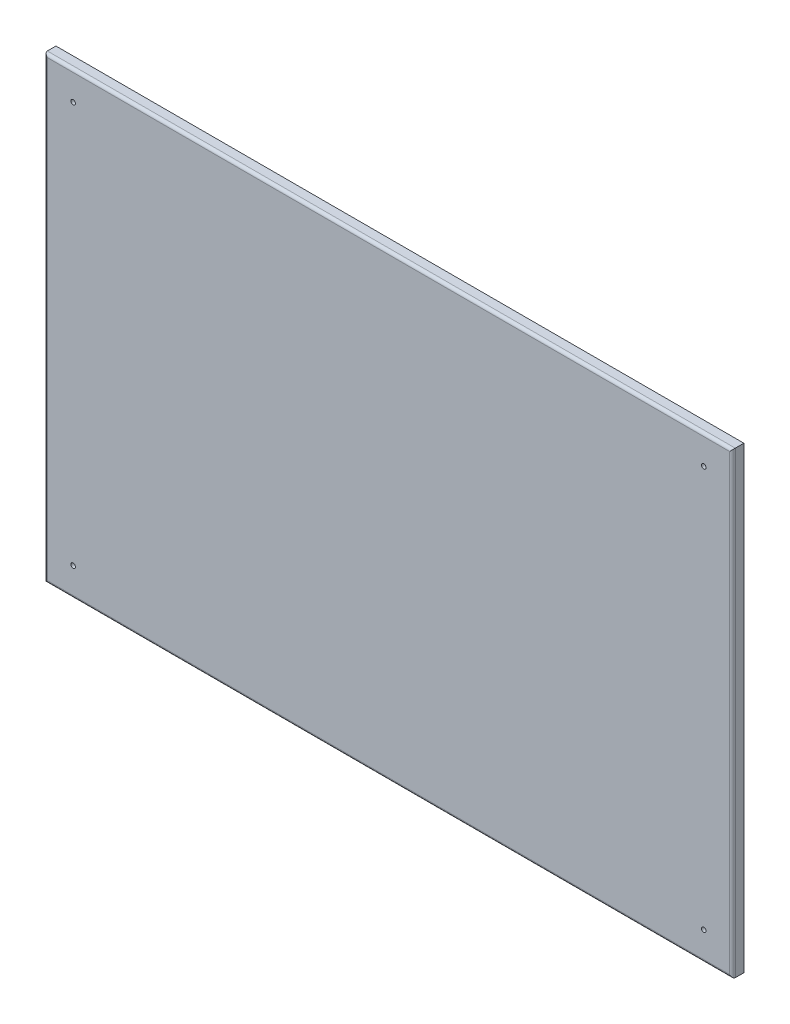
ISO-10303-21;
HEADER;
FILE_DESCRIPTION(('STEP AP214'),'2;1');
FILE_NAME('part.step','',(''),(''),'','','');
FILE_SCHEMA(('AUTOMOTIVE_DESIGN { 1 0 10303 214 1 1 1 1 }'));
ENDSEC;
DATA;
#1=APPLICATION_CONTEXT('core data for automotive mechanical design processes');
#2=APPLICATION_PROTOCOL_DEFINITION('international standard','automotive_design',2000,#1);
#3=PRODUCT_CONTEXT('',#1,'mechanical');
#4=PRODUCT('Part','Part','',(#3));
#5=PRODUCT_RELATED_PRODUCT_CATEGORY('part','',(#4));
#6=PRODUCT_DEFINITION_FORMATION('','',#4);
#7=PRODUCT_DEFINITION_CONTEXT('part definition',#1,'design');
#8=PRODUCT_DEFINITION('design','',#6,#7);
#9=PRODUCT_DEFINITION_SHAPE('','',#8);
#10=(LENGTH_UNIT() NAMED_UNIT(*) SI_UNIT(.MILLI.,.METRE.));
#11=(NAMED_UNIT(*) PLANE_ANGLE_UNIT() SI_UNIT($,.RADIAN.));
#12=(NAMED_UNIT(*) SI_UNIT($,.STERADIAN.) SOLID_ANGLE_UNIT());
#13=UNCERTAINTY_MEASURE_WITH_UNIT(LENGTH_MEASURE(1.E-05),#10,'distance_accuracy_value','');
#14=(GEOMETRIC_REPRESENTATION_CONTEXT(3) GLOBAL_UNCERTAINTY_ASSIGNED_CONTEXT((#13)) GLOBAL_UNIT_ASSIGNED_CONTEXT((#10,
#11,#12)) REPRESENTATION_CONTEXT('',''));
#15=CARTESIAN_POINT('',(0.,0.,0.));
#16=DIRECTION('',(0.,0.,1.));
#17=DIRECTION('',(1.,0.,0.));
#18=AXIS2_PLACEMENT_3D('',#15,#16,#17);
#19=CARTESIAN_POINT('',(600.,-400.,20.));
#20=DIRECTION('',(-1.,0.,0.));
#21=DIRECTION('',(0.,0.,1.));
#22=AXIS2_PLACEMENT_3D('',#19,#20,#21);
#23=PLANE('',#22);
#24=DIRECTION('',(0.,0.,-1.));
#25=VECTOR('',#24,1.);
#26=CARTESIAN_POINT('',(600.,400.,20.));
#27=LINE('',#26,#25);
#28=CARTESIAN_POINT('',(600.,400.,15.));
#29=VERTEX_POINT('',#28);
#30=CARTESIAN_POINT('',(600.,400.,0.));
#31=VERTEX_POINT('',#30);
#32=EDGE_CURVE('E93',#29,#31,#27,.T.);
#33=ORIENTED_EDGE('',*,*,#32,.F.);
#34=DIRECTION('',(0.,1.,0.));
#35=VECTOR('',#34,1.);
#36=CARTESIAN_POINT('',(600.,-400.,15.));
#37=LINE('',#36,#35);
#38=CARTESIAN_POINT('',(600.,-400.,15.));
#39=VERTEX_POINT('',#38);
#40=EDGE_CURVE('E11',#29,#39,#37,.F.);
#41=ORIENTED_EDGE('',*,*,#40,.T.);
#42=DIRECTION('',(0.,0.,-1.));
#43=VECTOR('',#42,1.);
#44=CARTESIAN_POINT('',(600.,-400.,20.));
#45=LINE('',#44,#43);
#46=CARTESIAN_POINT('',(600.,-400.,0.));
#47=VERTEX_POINT('',#46);
#48=EDGE_CURVE('E112',#39,#47,#45,.T.);
#49=ORIENTED_EDGE('',*,*,#48,.T.);
#50=DIRECTION('',(0.,1.,0.));
#51=VECTOR('',#50,1.);
#52=CARTESIAN_POINT('',(600.,-400.,0.));
#53=LINE('',#52,#51);
#54=EDGE_CURVE('E106',#47,#31,#53,.T.);
#55=ORIENTED_EDGE('',*,*,#54,.T.);
#56=EDGE_LOOP('',(#33,#41,#49,#55));
#57=FACE_BOUND('',#56,.T.);
#58=ADVANCED_FACE('F39',(#57),#23,.F.);
#59=CARTESIAN_POINT('',(-600.,400.,20.));
#60=DIRECTION('',(0.,-1.,0.));
#61=DIRECTION('',(0.,0.,-1.));
#62=AXIS2_PLACEMENT_3D('',#59,#60,#61);
#63=PLANE('',#62);
#64=DIRECTION('',(0.,0.,-1.));
#65=VECTOR('',#64,1.);
#66=CARTESIAN_POINT('',(-600.,400.,20.));
#67=LINE('',#66,#65);
#68=CARTESIAN_POINT('',(-600.,400.,15.));
#69=VERTEX_POINT('',#68);
#70=CARTESIAN_POINT('',(-600.,400.,0.));
#71=VERTEX_POINT('',#70);
#72=EDGE_CURVE('E99',#69,#71,#67,.T.);
#73=ORIENTED_EDGE('',*,*,#72,.F.);
#74=DIRECTION('',(-1.,0.,0.));
#75=VECTOR('',#74,1.);
#76=CARTESIAN_POINT('',(-600.,400.,15.));
#77=LINE('',#76,#75);
#78=EDGE_CURVE('E57',#69,#29,#77,.F.);
#79=ORIENTED_EDGE('',*,*,#78,.T.);
#80=ORIENTED_EDGE('',*,*,#32,.T.);
#81=DIRECTION('',(-1.,0.,0.));
#82=VECTOR('',#81,1.);
#83=CARTESIAN_POINT('',(-600.,400.,0.));
#84=LINE('',#83,#82);
#85=EDGE_CURVE('E94',#31,#71,#84,.T.);
#86=ORIENTED_EDGE('',*,*,#85,.T.);
#87=EDGE_LOOP('',(#73,#79,#80,#86));
#88=FACE_BOUND('',#87,.T.);
#89=ADVANCED_FACE('F91',(#88),#63,.F.);
#90=CARTESIAN_POINT('',(-600.,-400.,20.));
#91=DIRECTION('',(1.,0.,0.));
#92=DIRECTION('',(0.,0.,-1.));
#93=AXIS2_PLACEMENT_3D('',#90,#91,#92);
#94=PLANE('',#93);
#95=DIRECTION('',(0.,0.,-1.));
#96=VECTOR('',#95,1.);
#97=CARTESIAN_POINT('',(-600.,-400.,20.));
#98=LINE('',#97,#96);
#99=CARTESIAN_POINT('',(-600.,-400.,15.));
#100=VERTEX_POINT('',#99);
#101=CARTESIAN_POINT('',(-600.,-400.,0.));
#102=VERTEX_POINT('',#101);
#103=EDGE_CURVE('E123',#100,#102,#98,.T.);
#104=ORIENTED_EDGE('',*,*,#103,.F.);
#105=DIRECTION('',(0.,-1.,0.));
#106=VECTOR('',#105,1.);
#107=CARTESIAN_POINT('',(-600.,-400.,15.));
#108=LINE('',#107,#106);
#109=EDGE_CURVE('E48',#100,#69,#108,.F.);
#110=ORIENTED_EDGE('',*,*,#109,.T.);
#111=ORIENTED_EDGE('',*,*,#72,.T.);
#112=DIRECTION('',(0.,-1.,0.));
#113=VECTOR('',#112,1.);
#114=CARTESIAN_POINT('',(-600.,-400.,0.));
#115=LINE('',#114,#113);
#116=EDGE_CURVE('E107',#71,#102,#115,.T.);
#117=ORIENTED_EDGE('',*,*,#116,.T.);
#118=EDGE_LOOP('',(#104,#110,#111,#117));
#119=FACE_BOUND('',#118,.T.);
#120=ADVANCED_FACE('F162',(#119),#94,.F.);
#121=CARTESIAN_POINT('',(-600.,-400.,20.));
#122=DIRECTION('',(0.,1.,0.));
#123=DIRECTION('',(0.,0.,1.));
#124=AXIS2_PLACEMENT_3D('',#121,#122,#123);
#125=PLANE('',#124);
#126=ORIENTED_EDGE('',*,*,#48,.F.);
#127=DIRECTION('',(1.,0.,0.));
#128=VECTOR('',#127,1.);
#129=CARTESIAN_POINT('',(-600.,-400.,15.));
#130=LINE('',#129,#128);
#131=EDGE_CURVE('E135',#39,#100,#130,.F.);
#132=ORIENTED_EDGE('',*,*,#131,.T.);
#133=ORIENTED_EDGE('',*,*,#103,.T.);
#134=DIRECTION('',(1.,0.,0.));
#135=VECTOR('',#134,1.);
#136=CARTESIAN_POINT('',(-600.,-400.,0.));
#137=LINE('',#136,#135);
#138=EDGE_CURVE('E121',#102,#47,#137,.T.);
#139=ORIENTED_EDGE('',*,*,#138,.T.);
#140=EDGE_LOOP('',(#126,#132,#133,#139));
#141=FACE_BOUND('',#140,.T.);
#142=ADVANCED_FACE('F165',(#141),#125,.F.);
#143=CARTESIAN_POINT('',(0.,0.,20.));
#144=DIRECTION('',(0.,0.,-1.));
#145=DIRECTION('',(-1.,0.,0.));
#146=AXIS2_PLACEMENT_3D('',#143,#144,#145);
#147=PLANE('',#146);
#148=CARTESIAN_POINT('',(-550.,-350.,20.));
#149=DIRECTION('',(0.,0.,1.));
#150=DIRECTION('',(1.,0.,0.));
#151=AXIS2_PLACEMENT_3D('',#148,#149,#150);
#152=CIRCLE('',#151,3.99999999999999);
#153=CARTESIAN_POINT('',(-546.,-350.,20.));
#154=VERTEX_POINT('',#153);
#155=EDGE_CURVE('E218',#154,#154,#152,.T.);
#156=ORIENTED_EDGE('',*,*,#155,.F.);
#157=EDGE_LOOP('',(#156));
#158=FACE_BOUND('',#157,.T.);
#159=CARTESIAN_POINT('',(-550.,350.,20.));
#160=DIRECTION('',(0.,0.,1.));
#161=DIRECTION('',(1.,0.,0.));
#162=AXIS2_PLACEMENT_3D('',#159,#160,#161);
#163=CIRCLE('',#162,3.99999999999999);
#164=CARTESIAN_POINT('',(-546.,350.,20.));
#165=VERTEX_POINT('',#164);
#166=EDGE_CURVE('E226',#165,#165,#163,.T.);
#167=ORIENTED_EDGE('',*,*,#166,.F.);
#168=EDGE_LOOP('',(#167));
#169=FACE_BOUND('',#168,.T.);
#170=CARTESIAN_POINT('',(550.,-350.,20.));
#171=DIRECTION('',(0.,0.,1.));
#172=DIRECTION('',(1.,0.,0.));
#173=AXIS2_PLACEMENT_3D('',#170,#171,#172);
#174=CIRCLE('',#173,3.99999999999999);
#175=CARTESIAN_POINT('',(554.,-350.,20.));
#176=VERTEX_POINT('',#175);
#177=EDGE_CURVE('E235',#176,#176,#174,.T.);
#178=ORIENTED_EDGE('',*,*,#177,.F.);
#179=EDGE_LOOP('',(#178));
#180=FACE_BOUND('',#179,.T.);
#181=CARTESIAN_POINT('',(550.,350.,20.));
#182=DIRECTION('',(0.,0.,1.));
#183=DIRECTION('',(1.,0.,0.));
#184=AXIS2_PLACEMENT_3D('',#181,#182,#183);
#185=CIRCLE('',#184,3.99999999999999);
#186=CARTESIAN_POINT('',(554.,350.,20.));
#187=VERTEX_POINT('',#186);
#188=EDGE_CURVE('E141',#187,#187,#185,.T.);
#189=ORIENTED_EDGE('',*,*,#188,.F.);
#190=EDGE_LOOP('',(#189));
#191=FACE_BOUND('',#190,.T.);
#192=DIRECTION('',(-1.,0.,0.));
#193=VECTOR('',#192,1.);
#194=CARTESIAN_POINT('',(0.,395.,20.));
#195=LINE('',#194,#193);
#196=CARTESIAN_POINT('',(595.,395.,20.));
#197=VERTEX_POINT('',#196);
#198=CARTESIAN_POINT('',(-595.,395.,20.));
#199=VERTEX_POINT('',#198);
#200=EDGE_CURVE('E126',#197,#199,#195,.T.);
#201=ORIENTED_EDGE('',*,*,#200,.T.);
#202=DIRECTION('',(0.,-1.,0.));
#203=VECTOR('',#202,1.);
#204=CARTESIAN_POINT('',(-595.,0.,20.));
#205=LINE('',#204,#203);
#206=CARTESIAN_POINT('',(-595.,-395.,20.));
#207=VERTEX_POINT('',#206);
#208=EDGE_CURVE('E134',#199,#207,#205,.T.);
#209=ORIENTED_EDGE('',*,*,#208,.T.);
#210=DIRECTION('',(1.,0.,0.));
#211=VECTOR('',#210,1.);
#212=CARTESIAN_POINT('',(0.,-395.,20.));
#213=LINE('',#212,#211);
#214=CARTESIAN_POINT('',(595.,-395.,20.));
#215=VERTEX_POINT('',#214);
#216=EDGE_CURVE('E128',#207,#215,#213,.T.);
#217=ORIENTED_EDGE('',*,*,#216,.T.);
#218=DIRECTION('',(0.,1.,0.));
#219=VECTOR('',#218,1.);
#220=CARTESIAN_POINT('',(595.,0.,20.));
#221=LINE('',#220,#219);
#222=EDGE_CURVE('E97',#215,#197,#221,.T.);
#223=ORIENTED_EDGE('',*,*,#222,.T.);
#224=EDGE_LOOP('',(#201,#209,#217,#223));
#225=FACE_BOUND('',#224,.T.);
#226=ADVANCED_FACE('F154',(#158,#169,#180,#191,#225),#147,.F.);
#227=CARTESIAN_POINT('',(0.,0.,0.));
#228=DIRECTION('',(0.,0.,-1.));
#229=DIRECTION('',(-1.,0.,0.));
#230=AXIS2_PLACEMENT_3D('',#227,#228,#229);
#231=PLANE('',#230);
#232=CARTESIAN_POINT('',(-550.,-350.,0.));
#233=DIRECTION('',(0.,0.,1.));
#234=DIRECTION('',(1.,0.,0.));
#235=AXIS2_PLACEMENT_3D('',#232,#233,#234);
#236=CIRCLE('',#235,3.99999999999999);
#237=CARTESIAN_POINT('',(-546.,-350.,0.));
#238=VERTEX_POINT('',#237);
#239=EDGE_CURVE('E222',#238,#238,#236,.T.);
#240=ORIENTED_EDGE('',*,*,#239,.T.);
#241=EDGE_LOOP('',(#240));
#242=FACE_BOUND('',#241,.T.);
#243=CARTESIAN_POINT('',(-550.,350.,0.));
#244=DIRECTION('',(0.,0.,1.));
#245=DIRECTION('',(1.,0.,0.));
#246=AXIS2_PLACEMENT_3D('',#243,#244,#245);
#247=CIRCLE('',#246,3.99999999999999);
#248=CARTESIAN_POINT('',(-546.,350.,0.));
#249=VERTEX_POINT('',#248);
#250=EDGE_CURVE('E224',#249,#249,#247,.T.);
#251=ORIENTED_EDGE('',*,*,#250,.T.);
#252=EDGE_LOOP('',(#251));
#253=FACE_BOUND('',#252,.T.);
#254=CARTESIAN_POINT('',(550.,-350.,0.));
#255=DIRECTION('',(0.,0.,1.));
#256=DIRECTION('',(1.,0.,0.));
#257=AXIS2_PLACEMENT_3D('',#254,#255,#256);
#258=CIRCLE('',#257,3.99999999999999);
#259=CARTESIAN_POINT('',(554.,-350.,0.));
#260=VERTEX_POINT('',#259);
#261=EDGE_CURVE('E228',#260,#260,#258,.T.);
#262=ORIENTED_EDGE('',*,*,#261,.T.);
#263=EDGE_LOOP('',(#262));
#264=FACE_BOUND('',#263,.T.);
#265=CARTESIAN_POINT('',(550.,350.,0.));
#266=DIRECTION('',(0.,0.,1.));
#267=DIRECTION('',(1.,0.,0.));
#268=AXIS2_PLACEMENT_3D('',#265,#266,#267);
#269=CIRCLE('',#268,3.99999999999999);
#270=CARTESIAN_POINT('',(554.,350.,0.));
#271=VERTEX_POINT('',#270);
#272=EDGE_CURVE('E117',#271,#271,#269,.T.);
#273=ORIENTED_EDGE('',*,*,#272,.T.);
#274=EDGE_LOOP('',(#273));
#275=FACE_BOUND('',#274,.T.);
#276=ORIENTED_EDGE('',*,*,#54,.F.);
#277=ORIENTED_EDGE('',*,*,#138,.F.);
#278=ORIENTED_EDGE('',*,*,#116,.F.);
#279=ORIENTED_EDGE('',*,*,#85,.F.);
#280=EDGE_LOOP('',(#276,#277,#278,#279));
#281=FACE_BOUND('',#280,.T.);
#282=ADVANCED_FACE('F102',(#242,#253,#264,#275,#281),#231,.T.);
#283=CARTESIAN_POINT('',(0.,395.,15.));
#284=DIRECTION('',(-1.,0.,0.));
#285=DIRECTION('',(0.,0.,1.));
#286=AXIS2_PLACEMENT_3D('',#283,#284,#285);
#287=CYLINDRICAL_SURFACE('',#286,5.);
#288=CARTESIAN_POINT('',(595.,395.,15.));
#289=DIRECTION('',(-0.707106781186547,0.707106781186547,0.));
#290=DIRECTION('',(0.707106781186547,0.707106781186547,0.));
#291=AXIS2_PLACEMENT_3D('',#288,#289,#290);
#292=ELLIPSE('',#291,7.07106781186547,5.);
#293=EDGE_CURVE('E113',#29,#197,#292,.F.);
#294=ORIENTED_EDGE('',*,*,#293,.F.);
#295=ORIENTED_EDGE('',*,*,#78,.F.);
#296=CARTESIAN_POINT('',(-595.,395.,15.));
#297=DIRECTION('',(-0.707106781186547,-0.707106781186547,0.));
#298=DIRECTION('',(0.707106781186547,-0.707106781186547,0.));
#299=AXIS2_PLACEMENT_3D('',#296,#297,#298);
#300=ELLIPSE('',#299,7.07106781186547,5.);
#301=EDGE_CURVE('E43',#199,#69,#300,.T.);
#302=ORIENTED_EDGE('',*,*,#301,.F.);
#303=ORIENTED_EDGE('',*,*,#200,.F.);
#304=EDGE_LOOP('',(#294,#295,#302,#303));
#305=FACE_BOUND('',#304,.T.);
#306=ADVANCED_FACE('F41',(#305),#287,.T.);
#307=CARTESIAN_POINT('',(-595.,0.,15.));
#308=DIRECTION('',(0.,-1.,0.));
#309=DIRECTION('',(0.,0.,-1.));
#310=AXIS2_PLACEMENT_3D('',#307,#308,#309);
#311=CYLINDRICAL_SURFACE('',#310,5.);
#312=ORIENTED_EDGE('',*,*,#301,.T.);
#313=ORIENTED_EDGE('',*,*,#109,.F.);
#314=CARTESIAN_POINT('',(-595.,-395.,15.));
#315=DIRECTION('',(0.707106781186547,-0.707106781186547,0.));
#316=DIRECTION('',(-0.707106781186547,-0.707106781186547,0.));
#317=AXIS2_PLACEMENT_3D('',#314,#315,#316);
#318=ELLIPSE('',#317,7.07106781186547,5.);
#319=EDGE_CURVE('E142',#207,#100,#318,.T.);
#320=ORIENTED_EDGE('',*,*,#319,.F.);
#321=ORIENTED_EDGE('',*,*,#208,.F.);
#322=EDGE_LOOP('',(#312,#313,#320,#321));
#323=FACE_BOUND('',#322,.T.);
#324=ADVANCED_FACE('F182',(#323),#311,.T.);
#325=CARTESIAN_POINT('',(595.,0.,15.));
#326=DIRECTION('',(0.,1.,0.));
#327=DIRECTION('',(0.,0.,1.));
#328=AXIS2_PLACEMENT_3D('',#325,#326,#327);
#329=CYLINDRICAL_SURFACE('',#328,5.);
#330=ORIENTED_EDGE('',*,*,#293,.T.);
#331=ORIENTED_EDGE('',*,*,#222,.F.);
#332=CARTESIAN_POINT('',(595.,-395.,15.));
#333=DIRECTION('',(0.707106781186547,0.707106781186547,0.));
#334=DIRECTION('',(-0.707106781186547,0.707106781186547,0.));
#335=AXIS2_PLACEMENT_3D('',#332,#333,#334);
#336=ELLIPSE('',#335,7.07106781186547,5.);
#337=EDGE_CURVE('E139',#39,#215,#336,.F.);
#338=ORIENTED_EDGE('',*,*,#337,.F.);
#339=ORIENTED_EDGE('',*,*,#40,.F.);
#340=EDGE_LOOP('',(#330,#331,#338,#339));
#341=FACE_BOUND('',#340,.T.);
#342=ADVANCED_FACE('F146',(#341),#329,.T.);
#343=CARTESIAN_POINT('',(0.,-395.,15.));
#344=DIRECTION('',(1.,0.,0.));
#345=DIRECTION('',(0.,0.,-1.));
#346=AXIS2_PLACEMENT_3D('',#343,#344,#345);
#347=CYLINDRICAL_SURFACE('',#346,5.);
#348=ORIENTED_EDGE('',*,*,#319,.T.);
#349=ORIENTED_EDGE('',*,*,#131,.F.);
#350=ORIENTED_EDGE('',*,*,#337,.T.);
#351=ORIENTED_EDGE('',*,*,#216,.F.);
#352=EDGE_LOOP('',(#348,#349,#350,#351));
#353=FACE_BOUND('',#352,.T.);
#354=ADVANCED_FACE('F157',(#353),#347,.T.);
#355=CARTESIAN_POINT('',(550.,350.,20.));
#356=DIRECTION('',(0.,0.,-1.));
#357=DIRECTION('',(-1.,0.,0.));
#358=AXIS2_PLACEMENT_3D('',#355,#356,#357);
#359=CYLINDRICAL_SURFACE('',#358,3.99999999999999);
#360=ORIENTED_EDGE('',*,*,#188,.T.);
#361=EDGE_LOOP('',(#360));
#362=FACE_BOUND('',#361,.T.);
#363=ORIENTED_EDGE('',*,*,#272,.F.);
#364=EDGE_LOOP('',(#363));
#365=FACE_BOUND('',#364,.T.);
#366=ADVANCED_FACE('F178',(#362,#365),#359,.F.);
#367=CARTESIAN_POINT('',(550.,-350.,20.));
#368=DIRECTION('',(0.,0.,-1.));
#369=DIRECTION('',(-1.,0.,0.));
#370=AXIS2_PLACEMENT_3D('',#367,#368,#369);
#371=CYLINDRICAL_SURFACE('',#370,3.99999999999999);
#372=ORIENTED_EDGE('',*,*,#177,.T.);
#373=EDGE_LOOP('',(#372));
#374=FACE_BOUND('',#373,.T.);
#375=ORIENTED_EDGE('',*,*,#261,.F.);
#376=EDGE_LOOP('',(#375));
#377=FACE_BOUND('',#376,.T.);
#378=ADVANCED_FACE('F201',(#374,#377),#371,.F.);
#379=CARTESIAN_POINT('',(-550.,350.,20.));
#380=DIRECTION('',(0.,0.,-1.));
#381=DIRECTION('',(-1.,0.,0.));
#382=AXIS2_PLACEMENT_3D('',#379,#380,#381);
#383=CYLINDRICAL_SURFACE('',#382,3.99999999999999);
#384=ORIENTED_EDGE('',*,*,#166,.T.);
#385=EDGE_LOOP('',(#384));
#386=FACE_BOUND('',#385,.T.);
#387=ORIENTED_EDGE('',*,*,#250,.F.);
#388=EDGE_LOOP('',(#387));
#389=FACE_BOUND('',#388,.T.);
#390=ADVANCED_FACE('F210',(#386,#389),#383,.F.);
#391=CARTESIAN_POINT('',(-550.,-350.,20.));
#392=DIRECTION('',(0.,0.,-1.));
#393=DIRECTION('',(-1.,0.,0.));
#394=AXIS2_PLACEMENT_3D('',#391,#392,#393);
#395=CYLINDRICAL_SURFACE('',#394,3.99999999999999);
#396=ORIENTED_EDGE('',*,*,#155,.T.);
#397=EDGE_LOOP('',(#396));
#398=FACE_BOUND('',#397,.T.);
#399=ORIENTED_EDGE('',*,*,#239,.F.);
#400=EDGE_LOOP('',(#399));
#401=FACE_BOUND('',#400,.T.);
#402=ADVANCED_FACE('F211',(#398,#401),#395,.F.);
#403=CLOSED_SHELL('',(#58,#89,#120,#142,#226,#282,#306,#324,#342,#354,#366,#378,#390,#402));
#404=MANIFOLD_SOLID_BREP('B2',#403);
#405=ADVANCED_BREP_SHAPE_REPRESENTATION('',(#18,#404),#14);
#406=SHAPE_DEFINITION_REPRESENTATION(#9,#405);
ENDSEC;
END-ISO-10303-21;
